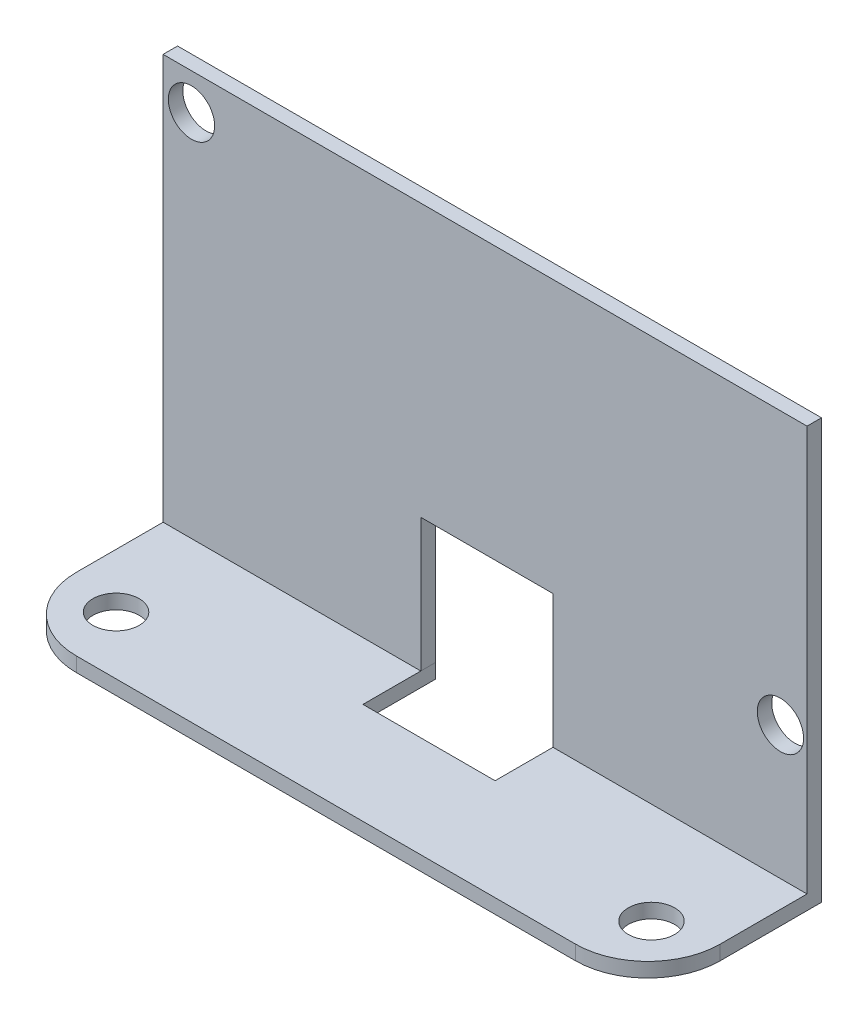
ISO-10303-21;
HEADER;
FILE_DESCRIPTION(('STEP AP214'),'2;1');
FILE_NAME('part.step','',(''),(''),'','','');
FILE_SCHEMA(('AUTOMOTIVE_DESIGN { 1 0 10303 214 1 1 1 1 }'));
ENDSEC;
DATA;
#1=APPLICATION_CONTEXT('core data for automotive mechanical design processes');
#2=APPLICATION_PROTOCOL_DEFINITION('international standard','automotive_design',2000,#1);
#3=PRODUCT_CONTEXT('',#1,'mechanical');
#4=PRODUCT('Part','Part','',(#3));
#5=PRODUCT_RELATED_PRODUCT_CATEGORY('part','',(#4));
#6=PRODUCT_DEFINITION_FORMATION('','',#4);
#7=PRODUCT_DEFINITION_CONTEXT('part definition',#1,'design');
#8=PRODUCT_DEFINITION('design','',#6,#7);
#9=PRODUCT_DEFINITION_SHAPE('','',#8);
#10=(LENGTH_UNIT() NAMED_UNIT(*) SI_UNIT(.MILLI.,.METRE.));
#11=(NAMED_UNIT(*) PLANE_ANGLE_UNIT() SI_UNIT($,.RADIAN.));
#12=(NAMED_UNIT(*) SI_UNIT($,.STERADIAN.) SOLID_ANGLE_UNIT());
#13=UNCERTAINTY_MEASURE_WITH_UNIT(LENGTH_MEASURE(1.E-05),#10,'distance_accuracy_value','');
#14=(GEOMETRIC_REPRESENTATION_CONTEXT(3) GLOBAL_UNCERTAINTY_ASSIGNED_CONTEXT((#13)) GLOBAL_UNIT_ASSIGNED_CONTEXT((#10,
#11,#12)) REPRESENTATION_CONTEXT('',''));
#15=CARTESIAN_POINT('',(0.,0.,0.));
#16=DIRECTION('',(0.,0.,1.));
#17=DIRECTION('',(1.,0.,0.));
#18=AXIS2_PLACEMENT_3D('',#15,#16,#17);
#19=CARTESIAN_POINT('',(-18.1571957093631,6.61007299270073,12.));
#20=DIRECTION('',(1.,0.,0.));
#21=DIRECTION('',(0.,1.,0.));
#22=AXIS2_PLACEMENT_3D('',#19,#20,#21);
#23=PLANE('',#22);
#24=DIRECTION('',(0.,0.,-1.));
#25=VECTOR('',#24,1.);
#26=CARTESIAN_POINT('',(-18.1571957093631,-22.3899270072993,12.));
#27=LINE('',#26,#25);
#28=CARTESIAN_POINT('',(-18.1571957093631,-22.3899270072993,7.));
#29=VERTEX_POINT('',#28);
#30=CARTESIAN_POINT('',(-18.1571957093631,-22.3899270072993,0.));
#31=VERTEX_POINT('',#30);
#32=EDGE_CURVE('E262',#29,#31,#27,.T.);
#33=ORIENTED_EDGE('',*,*,#32,.F.);
#34=DIRECTION('',(0.,-1.,0.));
#35=VECTOR('',#34,1.);
#36=CARTESIAN_POINT('',(-18.1571957093631,-21.3899270072993,7.));
#37=LINE('',#36,#35);
#38=CARTESIAN_POINT('',(-18.1571957093631,-21.3899270072993,7.));
#39=VERTEX_POINT('',#38);
#40=EDGE_CURVE('E269',#29,#39,#37,.F.);
#41=ORIENTED_EDGE('',*,*,#40,.T.);
#42=DIRECTION('',(0.,0.,-1.));
#43=VECTOR('',#42,1.);
#44=CARTESIAN_POINT('',(-18.1571957093631,-21.3899270072993,0.));
#45=LINE('',#44,#43);
#46=CARTESIAN_POINT('',(-18.1571957093631,-21.3899270072993,1.));
#47=VERTEX_POINT('',#46);
#48=EDGE_CURVE('E224',#39,#47,#45,.T.);
#49=ORIENTED_EDGE('',*,*,#48,.T.);
#50=DIRECTION('',(0.,1.,0.));
#51=VECTOR('',#50,1.);
#52=CARTESIAN_POINT('',(-18.1571957093631,0.,1.));
#53=LINE('',#52,#51);
#54=CARTESIAN_POINT('',(-18.1571957093631,6.61007299270073,1.));
#55=VERTEX_POINT('',#54);
#56=EDGE_CURVE('E228',#47,#55,#53,.T.);
#57=ORIENTED_EDGE('',*,*,#56,.T.);
#58=DIRECTION('',(0.,0.,-1.));
#59=VECTOR('',#58,1.);
#60=CARTESIAN_POINT('',(-18.1571957093631,6.61007299270073,12.));
#61=LINE('',#60,#59);
#62=CARTESIAN_POINT('',(-18.1571957093631,6.61007299270073,0.));
#63=VERTEX_POINT('',#62);
#64=EDGE_CURVE('E244',#55,#63,#61,.T.);
#65=ORIENTED_EDGE('',*,*,#64,.T.);
#66=DIRECTION('',(0.,-1.,0.));
#67=VECTOR('',#66,1.);
#68=CARTESIAN_POINT('',(-18.1571957093631,6.61007299270073,0.));
#69=LINE('',#68,#67);
#70=EDGE_CURVE('E236',#63,#31,#69,.T.);
#71=ORIENTED_EDGE('',*,*,#70,.T.);
#72=EDGE_LOOP('',(#33,#41,#49,#57,#65,#71));
#73=FACE_BOUND('',#72,.T.);
#74=ADVANCED_FACE('F33',(#73),#23,.F.);
#75=CARTESIAN_POINT('',(26.3428042906369,6.61007299270073,12.));
#76=DIRECTION('',(-1.,0.,0.));
#77=DIRECTION('',(0.,-1.,0.));
#78=AXIS2_PLACEMENT_3D('',#75,#76,#77);
#79=PLANE('',#78);
#80=DIRECTION('',(0.,0.,-1.));
#81=VECTOR('',#80,1.);
#82=CARTESIAN_POINT('',(26.3428042906369,-21.3899270072993,0.));
#83=LINE('',#82,#81);
#84=CARTESIAN_POINT('',(26.3428042906369,-21.3899270072993,7.));
#85=VERTEX_POINT('',#84);
#86=CARTESIAN_POINT('',(26.3428042906369,-21.3899270072993,1.));
#87=VERTEX_POINT('',#86);
#88=EDGE_CURVE('E225',#85,#87,#83,.T.);
#89=ORIENTED_EDGE('',*,*,#88,.F.);
#90=DIRECTION('',(0.,1.,0.));
#91=VECTOR('',#90,1.);
#92=CARTESIAN_POINT('',(26.3428042906369,-22.3899270072993,7.));
#93=LINE('',#92,#91);
#94=CARTESIAN_POINT('',(26.3428042906369,-22.3899270072993,7.));
#95=VERTEX_POINT('',#94);
#96=EDGE_CURVE('E41',#85,#95,#93,.F.);
#97=ORIENTED_EDGE('',*,*,#96,.T.);
#98=DIRECTION('',(0.,0.,-1.));
#99=VECTOR('',#98,1.);
#100=CARTESIAN_POINT('',(26.3428042906369,-22.3899270072993,12.));
#101=LINE('',#100,#99);
#102=CARTESIAN_POINT('',(26.3428042906369,-22.3899270072993,0.));
#103=VERTEX_POINT('',#102);
#104=EDGE_CURVE('E260',#95,#103,#101,.T.);
#105=ORIENTED_EDGE('',*,*,#104,.T.);
#106=DIRECTION('',(0.,1.,0.));
#107=VECTOR('',#106,1.);
#108=CARTESIAN_POINT('',(26.3428042906369,6.61007299270073,0.));
#109=LINE('',#108,#107);
#110=CARTESIAN_POINT('',(26.3428042906369,6.61007299270073,0.));
#111=VERTEX_POINT('',#110);
#112=EDGE_CURVE('E252',#103,#111,#109,.T.);
#113=ORIENTED_EDGE('',*,*,#112,.T.);
#114=DIRECTION('',(0.,0.,-1.));
#115=VECTOR('',#114,1.);
#116=CARTESIAN_POINT('',(26.3428042906369,6.61007299270073,12.));
#117=LINE('',#116,#115);
#118=CARTESIAN_POINT('',(26.3428042906369,6.61007299270073,1.));
#119=VERTEX_POINT('',#118);
#120=EDGE_CURVE('E258',#119,#111,#117,.T.);
#121=ORIENTED_EDGE('',*,*,#120,.F.);
#122=DIRECTION('',(0.,1.,0.));
#123=VECTOR('',#122,1.);
#124=CARTESIAN_POINT('',(26.3428042906369,0.,1.));
#125=LINE('',#124,#123);
#126=EDGE_CURVE('E227',#87,#119,#125,.T.);
#127=ORIENTED_EDGE('',*,*,#126,.F.);
#128=EDGE_LOOP('',(#89,#97,#105,#113,#121,#127));
#129=FACE_BOUND('',#128,.T.);
#130=ADVANCED_FACE('F301',(#129),#79,.F.);
#131=CARTESIAN_POINT('',(-18.1571957093631,6.61007299270073,12.));
#132=DIRECTION('',(0.,-1.,0.));
#133=DIRECTION('',(0.,0.,-1.));
#134=AXIS2_PLACEMENT_3D('',#131,#132,#133);
#135=PLANE('',#134);
#136=DIRECTION('',(-1.,0.,0.));
#137=VECTOR('',#136,1.);
#138=CARTESIAN_POINT('',(26.3428042906369,6.61007299270073,1.));
#139=LINE('',#138,#137);
#140=EDGE_CURVE('E238',#119,#55,#139,.T.);
#141=ORIENTED_EDGE('',*,*,#140,.F.);
#142=ORIENTED_EDGE('',*,*,#120,.T.);
#143=DIRECTION('',(-1.,0.,0.));
#144=VECTOR('',#143,1.);
#145=CARTESIAN_POINT('',(-18.1571957093631,6.61007299270073,0.));
#146=LINE('',#145,#144);
#147=EDGE_CURVE('E245',#111,#63,#146,.T.);
#148=ORIENTED_EDGE('',*,*,#147,.T.);
#149=ORIENTED_EDGE('',*,*,#64,.F.);
#150=EDGE_LOOP('',(#141,#142,#148,#149));
#151=FACE_BOUND('',#150,.T.);
#152=ADVANCED_FACE('F307',(#151),#135,.F.);
#153=CARTESIAN_POINT('',(0.,0.,12.));
#154=DIRECTION('',(0.,0.,1.));
#155=DIRECTION('',(1.,0.,0.));
#156=AXIS2_PLACEMENT_3D('',#153,#154,#155);
#157=PLANE('',#156);
#158=DIRECTION('',(1.,0.,0.));
#159=VECTOR('',#158,1.);
#160=CARTESIAN_POINT('',(-18.1571957093631,-22.3899270072993,12.));
#161=LINE('',#160,#159);
#162=CARTESIAN_POINT('',(-13.1571957093631,-22.3899270072993,12.));
#163=VERTEX_POINT('',#162);
#164=CARTESIAN_POINT('',(21.3428042906369,-22.3899270072993,12.));
#165=VERTEX_POINT('',#164);
#166=EDGE_CURVE('E241',#163,#165,#161,.T.);
#167=ORIENTED_EDGE('',*,*,#166,.T.);
#168=DIRECTION('',(0.,1.,0.));
#169=VECTOR('',#168,1.);
#170=CARTESIAN_POINT('',(21.3428042906369,-21.3899270072993,12.));
#171=LINE('',#170,#169);
#172=CARTESIAN_POINT('',(21.3428042906369,-21.3899270072993,12.));
#173=VERTEX_POINT('',#172);
#174=EDGE_CURVE('E274',#165,#173,#171,.T.);
#175=ORIENTED_EDGE('',*,*,#174,.T.);
#176=DIRECTION('',(-1.,0.,0.));
#177=VECTOR('',#176,1.);
#178=CARTESIAN_POINT('',(26.3428042906369,-21.3899270072993,12.));
#179=LINE('',#178,#177);
#180=CARTESIAN_POINT('',(-13.1571957093631,-21.3899270072993,12.));
#181=VERTEX_POINT('',#180);
#182=EDGE_CURVE('E230',#173,#181,#179,.T.);
#183=ORIENTED_EDGE('',*,*,#182,.T.);
#184=DIRECTION('',(0.,-1.,0.));
#185=VECTOR('',#184,1.);
#186=CARTESIAN_POINT('',(-13.1571957093631,-22.3899270072993,12.));
#187=LINE('',#186,#185);
#188=EDGE_CURVE('E264',#181,#163,#187,.T.);
#189=ORIENTED_EDGE('',*,*,#188,.T.);
#190=EDGE_LOOP('',(#167,#175,#183,#189));
#191=FACE_BOUND('',#190,.T.);
#192=ADVANCED_FACE('F279',(#191),#157,.T.);
#193=CARTESIAN_POINT('',(-18.1571957093631,-22.3899270072993,12.));
#194=DIRECTION('',(0.,1.,0.));
#195=DIRECTION('',(0.,0.,1.));
#196=AXIS2_PLACEMENT_3D('',#193,#194,#195);
#197=PLANE('',#196);
#198=CARTESIAN_POINT('',(22.5928042906369,-22.3899270072993,8.));
#199=DIRECTION('',(0.,1.,0.));
#200=DIRECTION('',(0.,0.,1.));
#201=AXIS2_PLACEMENT_3D('',#198,#199,#200);
#202=CIRCLE('',#201,1.6);
#203=CARTESIAN_POINT('',(22.5928042906369,-22.3899270072993,9.6));
#204=VERTEX_POINT('',#203);
#205=EDGE_CURVE('E177',#204,#204,#202,.T.);
#206=ORIENTED_EDGE('',*,*,#205,.T.);
#207=EDGE_LOOP('',(#206));
#208=FACE_BOUND('',#207,.T.);
#209=CARTESIAN_POINT('',(-14.4071957093631,-22.3899270072993,8.));
#210=DIRECTION('',(0.,1.,0.));
#211=DIRECTION('',(0.,0.,1.));
#212=AXIS2_PLACEMENT_3D('',#209,#210,#211);
#213=CIRCLE('',#212,1.6);
#214=CARTESIAN_POINT('',(-14.4071957093631,-22.3899270072993,9.6));
#215=VERTEX_POINT('',#214);
#216=EDGE_CURVE('E183',#215,#215,#213,.T.);
#217=ORIENTED_EDGE('',*,*,#216,.T.);
#218=EDGE_LOOP('',(#217));
#219=FACE_BOUND('',#218,.T.);
#220=DIRECTION('',(-1.,0.,0.));
#221=VECTOR('',#220,1.);
#222=CARTESIAN_POINT('',(-18.1571957093631,-22.3899270072993,5.));
#223=LINE('',#222,#221);
#224=CARTESIAN_POINT('',(8.78585994892824,-22.3899270072993,5.));
#225=VERTEX_POINT('',#224);
#226=CARTESIAN_POINT('',(-0.34789688899158,-22.3899270072993,5.));
#227=VERTEX_POINT('',#226);
#228=EDGE_CURVE('E147',#225,#227,#223,.T.);
#229=ORIENTED_EDGE('',*,*,#228,.F.);
#230=DIRECTION('',(0.,0.,-1.));
#231=VECTOR('',#230,1.);
#232=CARTESIAN_POINT('',(8.78585994892824,-22.3899270072993,12.));
#233=LINE('',#232,#231);
#234=CARTESIAN_POINT('',(8.78585994892824,-22.3899270072993,0.));
#235=VERTEX_POINT('',#234);
#236=EDGE_CURVE('E171',#225,#235,#233,.T.);
#237=ORIENTED_EDGE('',*,*,#236,.T.);
#238=DIRECTION('',(1.,0.,0.));
#239=VECTOR('',#238,1.);
#240=CARTESIAN_POINT('',(-18.1571957093631,-22.3899270072993,0.));
#241=LINE('',#240,#239);
#242=EDGE_CURVE('E248',#235,#103,#241,.T.);
#243=ORIENTED_EDGE('',*,*,#242,.T.);
#244=ORIENTED_EDGE('',*,*,#104,.F.);
#245=CARTESIAN_POINT('',(21.3428042906369,-22.3899270072993,7.));
#246=DIRECTION('',(0.,1.,0.));
#247=DIRECTION('',(0.,0.,1.));
#248=AXIS2_PLACEMENT_3D('',#245,#246,#247);
#249=CIRCLE('',#248,5.);
#250=EDGE_CURVE('E11',#95,#165,#249,.F.);
#251=ORIENTED_EDGE('',*,*,#250,.T.);
#252=ORIENTED_EDGE('',*,*,#166,.F.);
#253=CARTESIAN_POINT('',(-13.1571957093631,-22.3899270072993,7.));
#254=DIRECTION('',(0.,1.,0.));
#255=DIRECTION('',(0.,0.,1.));
#256=AXIS2_PLACEMENT_3D('',#253,#254,#255);
#257=CIRCLE('',#256,5.);
#258=EDGE_CURVE('E267',#163,#29,#257,.F.);
#259=ORIENTED_EDGE('',*,*,#258,.T.);
#260=ORIENTED_EDGE('',*,*,#32,.T.);
#261=CARTESIAN_POINT('',(-0.34789688899158,-22.3899270072993,0.));
#262=VERTEX_POINT('',#261);
#263=EDGE_CURVE('E249',#31,#262,#241,.T.);
#264=ORIENTED_EDGE('',*,*,#263,.T.);
#265=DIRECTION('',(0.,0.,1.));
#266=VECTOR('',#265,1.);
#267=CARTESIAN_POINT('',(-0.347896888991582,-22.3899270072993,12.));
#268=LINE('',#267,#266);
#269=EDGE_CURVE('E169',#262,#227,#268,.T.);
#270=ORIENTED_EDGE('',*,*,#269,.T.);
#271=EDGE_LOOP('',(#229,#237,#243,#244,#251,#252,#259,#260,#264,#270));
#272=FACE_BOUND('',#271,.T.);
#273=ADVANCED_FACE('F291',(#208,#219,#272),#197,.F.);
#274=CARTESIAN_POINT('',(0.,0.,0.));
#275=DIRECTION('',(0.,0.,1.));
#276=DIRECTION('',(1.,0.,0.));
#277=AXIS2_PLACEMENT_3D('',#274,#275,#276);
#278=PLANE('',#277);
#279=ORIENTED_EDGE('',*,*,#242,.F.);
#280=DIRECTION('',(0.,1.,0.));
#281=VECTOR('',#280,1.);
#282=CARTESIAN_POINT('',(8.78585994892824,0.,0.));
#283=LINE('',#282,#281);
#284=CARTESIAN_POINT('',(8.78585994892824,-12.1899270072993,0.));
#285=VERTEX_POINT('',#284);
#286=EDGE_CURVE('E209',#235,#285,#283,.T.);
#287=ORIENTED_EDGE('',*,*,#286,.T.);
#288=DIRECTION('',(-1.,0.,0.));
#289=VECTOR('',#288,1.);
#290=CARTESIAN_POINT('',(0.,-12.1899270072993,0.));
#291=LINE('',#290,#289);
#292=CARTESIAN_POINT('',(-0.348042189962719,-12.1899270072993,0.));
#293=VERTEX_POINT('',#292);
#294=EDGE_CURVE('E197',#285,#293,#291,.T.);
#295=ORIENTED_EDGE('',*,*,#294,.T.);
#296=DIRECTION('',(0.,-1.,0.));
#297=VECTOR('',#296,1.);
#298=CARTESIAN_POINT('',(-0.348042189962719,0.,0.));
#299=LINE('',#298,#297);
#300=CARTESIAN_POINT('',(-0.348042189962719,-21.3899270072993,0.));
#301=VERTEX_POINT('',#300);
#302=EDGE_CURVE('E204',#293,#301,#299,.T.);
#303=ORIENTED_EDGE('',*,*,#302,.T.);
#304=DIRECTION('',(1.,0.,0.));
#305=VECTOR('',#304,1.);
#306=CARTESIAN_POINT('',(0.,-21.3899270072993,0.));
#307=LINE('',#306,#305);
#308=CARTESIAN_POINT('',(-0.347896888991579,-21.3899270072993,0.));
#309=VERTEX_POINT('',#308);
#310=EDGE_CURVE('E207',#301,#309,#307,.T.);
#311=ORIENTED_EDGE('',*,*,#310,.T.);
#312=DIRECTION('',(0.,1.,0.));
#313=VECTOR('',#312,1.);
#314=CARTESIAN_POINT('',(-0.347896888991579,-21.3899270072993,0.));
#315=LINE('',#314,#313);
#316=EDGE_CURVE('E156',#262,#309,#315,.T.);
#317=ORIENTED_EDGE('',*,*,#316,.F.);
#318=ORIENTED_EDGE('',*,*,#263,.F.);
#319=ORIENTED_EDGE('',*,*,#70,.F.);
#320=ORIENTED_EDGE('',*,*,#147,.F.);
#321=ORIENTED_EDGE('',*,*,#112,.F.);
#322=EDGE_LOOP('',(#279,#287,#295,#303,#311,#317,#318,#319,#320,#321));
#323=FACE_BOUND('',#322,.T.);
#324=CARTESIAN_POINT('',(24.5040487477041,-12.1899270072993,0.));
#325=DIRECTION('',(0.,0.,1.));
#326=DIRECTION('',(1.,0.,0.));
#327=AXIS2_PLACEMENT_3D('',#324,#325,#326);
#328=CIRCLE('',#327,1.6);
#329=CARTESIAN_POINT('',(26.1040487477041,-12.1899270072993,0.));
#330=VERTEX_POINT('',#329);
#331=EDGE_CURVE('E215',#330,#330,#328,.T.);
#332=ORIENTED_EDGE('',*,*,#331,.T.);
#333=EDGE_LOOP('',(#332));
#334=FACE_BOUND('',#333,.T.);
#335=CARTESIAN_POINT('',(-16.1959512522959,4.11007299270073,0.));
#336=DIRECTION('',(0.,0.,1.));
#337=DIRECTION('',(1.,0.,0.));
#338=AXIS2_PLACEMENT_3D('',#335,#336,#337);
#339=CIRCLE('',#338,1.6);
#340=CARTESIAN_POINT('',(-14.5959512522959,4.11007299270073,0.));
#341=VERTEX_POINT('',#340);
#342=EDGE_CURVE('E221',#341,#341,#339,.T.);
#343=ORIENTED_EDGE('',*,*,#342,.T.);
#344=EDGE_LOOP('',(#343));
#345=FACE_BOUND('',#344,.T.);
#346=ADVANCED_FACE('F311',(#323,#334,#345),#278,.F.);
#347=CARTESIAN_POINT('',(26.3428042906369,-21.3899270072993,0.));
#348=DIRECTION('',(0.,1.,0.));
#349=DIRECTION('',(0.,0.,1.));
#350=AXIS2_PLACEMENT_3D('',#347,#348,#349);
#351=PLANE('',#350);
#352=DIRECTION('',(0.,0.,-1.));
#353=VECTOR('',#352,1.);
#354=CARTESIAN_POINT('',(8.78585994892824,-21.3899270072993,5.));
#355=LINE('',#354,#353);
#356=CARTESIAN_POINT('',(8.78585994892824,-21.3899270072993,5.));
#357=VERTEX_POINT('',#356);
#358=CARTESIAN_POINT('',(8.78585994892824,-21.3899270072993,1.));
#359=VERTEX_POINT('',#358);
#360=EDGE_CURVE('E158',#357,#359,#355,.T.);
#361=ORIENTED_EDGE('',*,*,#360,.F.);
#362=DIRECTION('',(1.,0.,0.));
#363=VECTOR('',#362,1.);
#364=CARTESIAN_POINT('',(8.78585994892824,-21.3899270072993,5.));
#365=LINE('',#364,#363);
#366=CARTESIAN_POINT('',(-0.347896888991579,-21.3899270072993,5.));
#367=VERTEX_POINT('',#366);
#368=EDGE_CURVE('E144',#367,#357,#365,.T.);
#369=ORIENTED_EDGE('',*,*,#368,.F.);
#370=DIRECTION('',(0.,0.,-1.));
#371=VECTOR('',#370,1.);
#372=CARTESIAN_POINT('',(-0.347896888991579,-21.3899270072993,5.));
#373=LINE('',#372,#371);
#374=EDGE_CURVE('E153',#367,#309,#373,.T.);
#375=ORIENTED_EDGE('',*,*,#374,.T.);
#376=ORIENTED_EDGE('',*,*,#310,.F.);
#377=DIRECTION('',(0.,0.,1.));
#378=VECTOR('',#377,1.);
#379=CARTESIAN_POINT('',(-0.348042189962719,-21.3899270072993,-15.77));
#380=LINE('',#379,#378);
#381=CARTESIAN_POINT('',(-0.348042189962719,-21.3899270072993,1.));
#382=VERTEX_POINT('',#381);
#383=EDGE_CURVE('E195',#301,#382,#380,.T.);
#384=ORIENTED_EDGE('',*,*,#383,.T.);
#385=DIRECTION('',(-1.,0.,0.));
#386=VECTOR('',#385,1.);
#387=CARTESIAN_POINT('',(26.3428042906369,-21.3899270072993,1.));
#388=LINE('',#387,#386);
#389=EDGE_CURVE('E237',#382,#47,#388,.T.);
#390=ORIENTED_EDGE('',*,*,#389,.T.);
#391=ORIENTED_EDGE('',*,*,#48,.F.);
#392=CARTESIAN_POINT('',(-13.1571957093631,-21.3899270072993,7.));
#393=DIRECTION('',(0.,1.,0.));
#394=DIRECTION('',(0.,0.,1.));
#395=AXIS2_PLACEMENT_3D('',#392,#393,#394);
#396=CIRCLE('',#395,5.);
#397=EDGE_CURVE('E271',#39,#181,#396,.T.);
#398=ORIENTED_EDGE('',*,*,#397,.T.);
#399=ORIENTED_EDGE('',*,*,#182,.F.);
#400=CARTESIAN_POINT('',(21.3428042906369,-21.3899270072993,7.));
#401=DIRECTION('',(0.,1.,0.));
#402=DIRECTION('',(0.,0.,1.));
#403=AXIS2_PLACEMENT_3D('',#400,#401,#402);
#404=CIRCLE('',#403,5.);
#405=EDGE_CURVE('E55',#173,#85,#404,.T.);
#406=ORIENTED_EDGE('',*,*,#405,.T.);
#407=ORIENTED_EDGE('',*,*,#88,.T.);
#408=EDGE_CURVE('E234',#87,#359,#388,.T.);
#409=ORIENTED_EDGE('',*,*,#408,.T.);
#410=EDGE_LOOP('',(#361,#369,#375,#376,#384,#390,#391,#398,#399,#406,#407,#409));
#411=FACE_BOUND('',#410,.T.);
#412=CARTESIAN_POINT('',(22.5928042906369,-21.3899270072993,8.));
#413=DIRECTION('',(0.,1.,0.));
#414=DIRECTION('',(0.,0.,1.));
#415=AXIS2_PLACEMENT_3D('',#412,#413,#414);
#416=CIRCLE('',#415,1.6);
#417=CARTESIAN_POINT('',(22.5928042906369,-21.3899270072993,9.6));
#418=VERTEX_POINT('',#417);
#419=EDGE_CURVE('E174',#418,#418,#416,.T.);
#420=ORIENTED_EDGE('',*,*,#419,.F.);
#421=EDGE_LOOP('',(#420));
#422=FACE_BOUND('',#421,.T.);
#423=CARTESIAN_POINT('',(-14.4071957093631,-21.3899270072993,8.));
#424=DIRECTION('',(0.,1.,0.));
#425=DIRECTION('',(0.,0.,1.));
#426=AXIS2_PLACEMENT_3D('',#423,#424,#425);
#427=CIRCLE('',#426,1.6);
#428=CARTESIAN_POINT('',(-14.4071957093631,-21.3899270072993,9.6));
#429=VERTEX_POINT('',#428);
#430=EDGE_CURVE('E180',#429,#429,#427,.T.);
#431=ORIENTED_EDGE('',*,*,#430,.F.);
#432=EDGE_LOOP('',(#431));
#433=FACE_BOUND('',#432,.T.);
#434=ADVANCED_FACE('F160',(#411,#422,#433),#351,.T.);
#435=CARTESIAN_POINT('',(26.3428042906369,0.,1.));
#436=DIRECTION('',(0.,0.,1.));
#437=DIRECTION('',(1.,0.,0.));
#438=AXIS2_PLACEMENT_3D('',#435,#436,#437);
#439=PLANE('',#438);
#440=DIRECTION('',(0.,1.,0.));
#441=VECTOR('',#440,1.);
#442=CARTESIAN_POINT('',(8.78585994892824,-12.1899270072993,1.));
#443=LINE('',#442,#441);
#444=CARTESIAN_POINT('',(8.78585994892824,-12.1899270072993,1.));
#445=VERTEX_POINT('',#444);
#446=EDGE_CURVE('E186',#359,#445,#443,.T.);
#447=ORIENTED_EDGE('',*,*,#446,.F.);
#448=ORIENTED_EDGE('',*,*,#408,.F.);
#449=ORIENTED_EDGE('',*,*,#126,.T.);
#450=ORIENTED_EDGE('',*,*,#140,.T.);
#451=ORIENTED_EDGE('',*,*,#56,.F.);
#452=ORIENTED_EDGE('',*,*,#389,.F.);
#453=DIRECTION('',(0.,-1.,0.));
#454=VECTOR('',#453,1.);
#455=CARTESIAN_POINT('',(-0.348042189962719,-12.1899270072993,1.));
#456=LINE('',#455,#454);
#457=CARTESIAN_POINT('',(-0.348042189962719,-12.1899270072993,1.));
#458=VERTEX_POINT('',#457);
#459=EDGE_CURVE('E191',#458,#382,#456,.T.);
#460=ORIENTED_EDGE('',*,*,#459,.F.);
#461=DIRECTION('',(-1.,0.,0.));
#462=VECTOR('',#461,1.);
#463=CARTESIAN_POINT('',(8.78585994892824,-12.1899270072993,1.));
#464=LINE('',#463,#462);
#465=EDGE_CURVE('E188',#445,#458,#464,.T.);
#466=ORIENTED_EDGE('',*,*,#465,.F.);
#467=EDGE_LOOP('',(#447,#448,#449,#450,#451,#452,#460,#466));
#468=FACE_BOUND('',#467,.T.);
#469=CARTESIAN_POINT('',(24.5040487477041,-12.1899270072993,1.));
#470=DIRECTION('',(0.,0.,1.));
#471=DIRECTION('',(1.,0.,0.));
#472=AXIS2_PLACEMENT_3D('',#469,#470,#471);
#473=CIRCLE('',#472,1.6);
#474=CARTESIAN_POINT('',(26.1040487477041,-12.1899270072993,1.));
#475=VERTEX_POINT('',#474);
#476=EDGE_CURVE('E212',#475,#475,#473,.T.);
#477=ORIENTED_EDGE('',*,*,#476,.F.);
#478=EDGE_LOOP('',(#477));
#479=FACE_BOUND('',#478,.T.);
#480=CARTESIAN_POINT('',(-16.1959512522959,4.11007299270073,1.));
#481=DIRECTION('',(0.,0.,1.));
#482=DIRECTION('',(1.,0.,0.));
#483=AXIS2_PLACEMENT_3D('',#480,#481,#482);
#484=CIRCLE('',#483,1.6);
#485=CARTESIAN_POINT('',(-14.5959512522959,4.11007299270073,1.));
#486=VERTEX_POINT('',#485);
#487=EDGE_CURVE('E218',#486,#486,#484,.T.);
#488=ORIENTED_EDGE('',*,*,#487,.F.);
#489=EDGE_LOOP('',(#488));
#490=FACE_BOUND('',#489,.T.);
#491=ADVANCED_FACE('F324',(#468,#479,#490),#439,.T.);
#492=CARTESIAN_POINT('',(-16.1959512522959,4.11007299270073,-15.77));
#493=DIRECTION('',(0.,0.,1.));
#494=DIRECTION('',(1.,0.,0.));
#495=AXIS2_PLACEMENT_3D('',#492,#493,#494);
#496=CYLINDRICAL_SURFACE('',#495,1.6);
#497=ORIENTED_EDGE('',*,*,#487,.T.);
#498=EDGE_LOOP('',(#497));
#499=FACE_BOUND('',#498,.T.);
#500=ORIENTED_EDGE('',*,*,#342,.F.);
#501=EDGE_LOOP('',(#500));
#502=FACE_BOUND('',#501,.T.);
#503=ADVANCED_FACE('F327',(#499,#502),#496,.F.);
#504=CARTESIAN_POINT('',(24.5040487477041,-12.1899270072993,-15.77));
#505=DIRECTION('',(0.,0.,1.));
#506=DIRECTION('',(1.,0.,0.));
#507=AXIS2_PLACEMENT_3D('',#504,#505,#506);
#508=CYLINDRICAL_SURFACE('',#507,1.6);
#509=ORIENTED_EDGE('',*,*,#476,.T.);
#510=EDGE_LOOP('',(#509));
#511=FACE_BOUND('',#510,.T.);
#512=ORIENTED_EDGE('',*,*,#331,.F.);
#513=EDGE_LOOP('',(#512));
#514=FACE_BOUND('',#513,.T.);
#515=ADVANCED_FACE('F331',(#511,#514),#508,.F.);
#516=CARTESIAN_POINT('',(8.78585994892824,-12.1899270072993,-15.77));
#517=DIRECTION('',(1.,0.,0.));
#518=DIRECTION('',(0.,0.,-1.));
#519=AXIS2_PLACEMENT_3D('',#516,#517,#518);
#520=PLANE('',#519);
#521=ORIENTED_EDGE('',*,*,#286,.F.);
#522=ORIENTED_EDGE('',*,*,#236,.F.);
#523=DIRECTION('',(0.,-1.,0.));
#524=VECTOR('',#523,1.);
#525=CARTESIAN_POINT('',(8.78585994892824,-21.3899270072993,5.));
#526=LINE('',#525,#524);
#527=EDGE_CURVE('E150',#357,#225,#526,.T.);
#528=ORIENTED_EDGE('',*,*,#527,.F.);
#529=ORIENTED_EDGE('',*,*,#360,.T.);
#530=ORIENTED_EDGE('',*,*,#446,.T.);
#531=DIRECTION('',(0.,0.,1.));
#532=VECTOR('',#531,1.);
#533=CARTESIAN_POINT('',(8.78585994892824,-12.1899270072993,-15.77));
#534=LINE('',#533,#532);
#535=EDGE_CURVE('E194',#285,#445,#534,.T.);
#536=ORIENTED_EDGE('',*,*,#535,.F.);
#537=EDGE_LOOP('',(#521,#522,#528,#529,#530,#536));
#538=FACE_BOUND('',#537,.T.);
#539=ADVANCED_FACE('F335',(#538),#520,.F.);
#540=CARTESIAN_POINT('',(-0.348042189962719,-12.1899270072993,-15.77));
#541=DIRECTION('',(-1.,0.,0.));
#542=DIRECTION('',(0.,0.,1.));
#543=AXIS2_PLACEMENT_3D('',#540,#541,#542);
#544=PLANE('',#543);
#545=DIRECTION('',(0.,0.,1.));
#546=VECTOR('',#545,1.);
#547=CARTESIAN_POINT('',(-0.348042189962719,-12.1899270072993,-15.77));
#548=LINE('',#547,#546);
#549=EDGE_CURVE('E198',#293,#458,#548,.T.);
#550=ORIENTED_EDGE('',*,*,#549,.T.);
#551=ORIENTED_EDGE('',*,*,#459,.T.);
#552=ORIENTED_EDGE('',*,*,#383,.F.);
#553=ORIENTED_EDGE('',*,*,#302,.F.);
#554=EDGE_LOOP('',(#550,#551,#552,#553));
#555=FACE_BOUND('',#554,.T.);
#556=ADVANCED_FACE('F339',(#555),#544,.F.);
#557=CARTESIAN_POINT('',(8.78585994892824,-12.1899270072993,-15.77));
#558=DIRECTION('',(0.,1.,0.));
#559=DIRECTION('',(0.,0.,1.));
#560=AXIS2_PLACEMENT_3D('',#557,#558,#559);
#561=PLANE('',#560);
#562=ORIENTED_EDGE('',*,*,#535,.T.);
#563=ORIENTED_EDGE('',*,*,#465,.T.);
#564=ORIENTED_EDGE('',*,*,#549,.F.);
#565=ORIENTED_EDGE('',*,*,#294,.F.);
#566=EDGE_LOOP('',(#562,#563,#564,#565));
#567=FACE_BOUND('',#566,.T.);
#568=ADVANCED_FACE('F341',(#567),#561,.F.);
#569=CARTESIAN_POINT('',(-14.4071957093631,-38.1599270072993,8.));
#570=DIRECTION('',(0.,1.,0.));
#571=DIRECTION('',(0.,0.,1.));
#572=AXIS2_PLACEMENT_3D('',#569,#570,#571);
#573=CYLINDRICAL_SURFACE('',#572,1.6);
#574=ORIENTED_EDGE('',*,*,#430,.T.);
#575=EDGE_LOOP('',(#574));
#576=FACE_BOUND('',#575,.T.);
#577=ORIENTED_EDGE('',*,*,#216,.F.);
#578=EDGE_LOOP('',(#577));
#579=FACE_BOUND('',#578,.T.);
#580=ADVANCED_FACE('F344',(#576,#579),#573,.F.);
#581=CARTESIAN_POINT('',(22.5928042906369,-38.1599270072993,8.));
#582=DIRECTION('',(0.,1.,0.));
#583=DIRECTION('',(0.,0.,1.));
#584=AXIS2_PLACEMENT_3D('',#581,#582,#583);
#585=CYLINDRICAL_SURFACE('',#584,1.6);
#586=ORIENTED_EDGE('',*,*,#419,.T.);
#587=EDGE_LOOP('',(#586));
#588=FACE_BOUND('',#587,.T.);
#589=ORIENTED_EDGE('',*,*,#205,.F.);
#590=EDGE_LOOP('',(#589));
#591=FACE_BOUND('',#590,.T.);
#592=ADVANCED_FACE('F299',(#588,#591),#585,.F.);
#593=CARTESIAN_POINT('',(-13.1571957093631,0.,7.));
#594=DIRECTION('',(0.,1.,0.));
#595=DIRECTION('',(-1.,0.,0.));
#596=AXIS2_PLACEMENT_3D('',#593,#594,#595);
#597=CYLINDRICAL_SURFACE('',#596,5.);
#598=ORIENTED_EDGE('',*,*,#397,.F.);
#599=ORIENTED_EDGE('',*,*,#40,.F.);
#600=ORIENTED_EDGE('',*,*,#258,.F.);
#601=ORIENTED_EDGE('',*,*,#188,.F.);
#602=EDGE_LOOP('',(#598,#599,#600,#601));
#603=FACE_BOUND('',#602,.T.);
#604=ADVANCED_FACE('F289',(#603),#597,.T.);
#605=CARTESIAN_POINT('',(21.3428042906369,0.,7.));
#606=DIRECTION('',(0.,-1.,0.));
#607=DIRECTION('',(1.,0.,0.));
#608=AXIS2_PLACEMENT_3D('',#605,#606,#607);
#609=CYLINDRICAL_SURFACE('',#608,5.);
#610=ORIENTED_EDGE('',*,*,#250,.F.);
#611=ORIENTED_EDGE('',*,*,#96,.F.);
#612=ORIENTED_EDGE('',*,*,#405,.F.);
#613=ORIENTED_EDGE('',*,*,#174,.F.);
#614=EDGE_LOOP('',(#610,#611,#612,#613));
#615=FACE_BOUND('',#614,.T.);
#616=ADVANCED_FACE('F35',(#615),#609,.T.);
#617=CARTESIAN_POINT('',(-0.347896888991579,-21.3899270072993,5.));
#618=DIRECTION('',(-1.,0.,0.));
#619=DIRECTION('',(0.,-1.,0.));
#620=AXIS2_PLACEMENT_3D('',#617,#618,#619);
#621=PLANE('',#620);
#622=ORIENTED_EDGE('',*,*,#316,.T.);
#623=ORIENTED_EDGE('',*,*,#374,.F.);
#624=DIRECTION('',(0.,1.,0.));
#625=VECTOR('',#624,1.);
#626=CARTESIAN_POINT('',(-0.347896888991579,-21.3899270072993,5.));
#627=LINE('',#626,#625);
#628=EDGE_CURVE('E139',#227,#367,#627,.T.);
#629=ORIENTED_EDGE('',*,*,#628,.F.);
#630=ORIENTED_EDGE('',*,*,#269,.F.);
#631=EDGE_LOOP('',(#622,#623,#629,#630));
#632=FACE_BOUND('',#631,.T.);
#633=ADVANCED_FACE('F154',(#632),#621,.F.);
#634=CARTESIAN_POINT('',(0.,0.,5.));
#635=DIRECTION('',(0.,0.,-1.));
#636=DIRECTION('',(-1.,0.,0.));
#637=AXIS2_PLACEMENT_3D('',#634,#635,#636);
#638=PLANE('',#637);
#639=ORIENTED_EDGE('',*,*,#228,.T.);
#640=ORIENTED_EDGE('',*,*,#628,.T.);
#641=ORIENTED_EDGE('',*,*,#368,.T.);
#642=ORIENTED_EDGE('',*,*,#527,.T.);
#643=EDGE_LOOP('',(#639,#640,#641,#642));
#644=FACE_BOUND('',#643,.T.);
#645=ADVANCED_FACE('F141',(#644),#638,.T.);
#646=CLOSED_SHELL('',(#74,#130,#152,#192,#273,#346,#434,#491,#503,#515,#539,#556,#568,#580,#592,
#604,#616,#633,#645));
#647=MANIFOLD_SOLID_BREP('B2',#646);
#648=ADVANCED_BREP_SHAPE_REPRESENTATION('',(#18,#647),#14);
#649=SHAPE_DEFINITION_REPRESENTATION(#9,#648);
ENDSEC;
END-ISO-10303-21;
